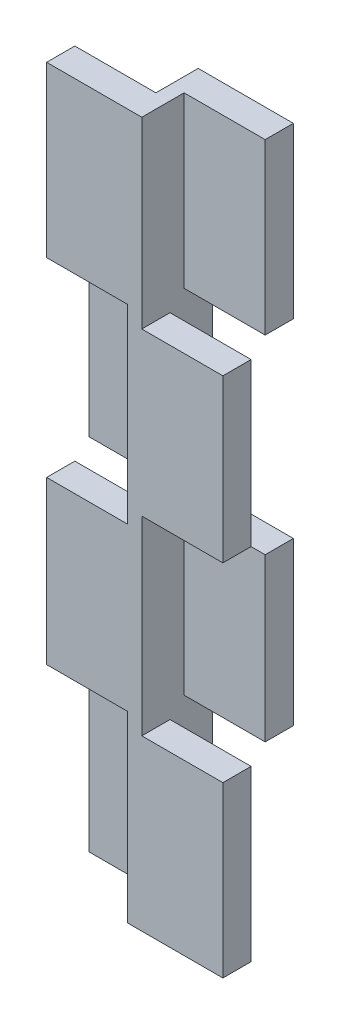
ISO-10303-21;
HEADER;
FILE_DESCRIPTION(('STEP AP214'),'2;1');
FILE_NAME('part.step','',(''),(''),'','','');
FILE_SCHEMA(('AUTOMOTIVE_DESIGN { 1 0 10303 214 1 1 1 1 }'));
ENDSEC;
DATA;
#1=APPLICATION_CONTEXT('core data for automotive mechanical design processes');
#2=APPLICATION_PROTOCOL_DEFINITION('international standard','automotive_design',2000,#1);
#3=PRODUCT_CONTEXT('',#1,'mechanical');
#4=PRODUCT('Part','Part','',(#3));
#5=PRODUCT_RELATED_PRODUCT_CATEGORY('part','',(#4));
#6=PRODUCT_DEFINITION_FORMATION('','',#4);
#7=PRODUCT_DEFINITION_CONTEXT('part definition',#1,'design');
#8=PRODUCT_DEFINITION('design','',#6,#7);
#9=PRODUCT_DEFINITION_SHAPE('','',#8);
#10=(LENGTH_UNIT() NAMED_UNIT(*) SI_UNIT(.MILLI.,.METRE.));
#11=(NAMED_UNIT(*) PLANE_ANGLE_UNIT() SI_UNIT($,.RADIAN.));
#12=(NAMED_UNIT(*) SI_UNIT($,.STERADIAN.) SOLID_ANGLE_UNIT());
#13=UNCERTAINTY_MEASURE_WITH_UNIT(LENGTH_MEASURE(1.E-05),#10,'distance_accuracy_value','');
#14=(GEOMETRIC_REPRESENTATION_CONTEXT(3) GLOBAL_UNCERTAINTY_ASSIGNED_CONTEXT((#13)) GLOBAL_UNIT_ASSIGNED_CONTEXT((#10,
#11,#12)) REPRESENTATION_CONTEXT('',''));
#15=CARTESIAN_POINT('',(0.,0.,0.));
#16=DIRECTION('',(0.,0.,1.));
#17=DIRECTION('',(1.,0.,0.));
#18=AXIS2_PLACEMENT_3D('',#15,#16,#17);
#19=CARTESIAN_POINT('',(0.25,0.,0.1));
#20=DIRECTION('',(-1.,0.,0.));
#21=DIRECTION('',(0.,0.,1.));
#22=AXIS2_PLACEMENT_3D('',#19,#20,#21);
#23=PLANE('',#22);
#24=DIRECTION('',(0.,0.,-1.));
#25=VECTOR('',#24,1.);
#26=CARTESIAN_POINT('',(0.25,0.,0.1));
#27=LINE('',#26,#25);
#28=CARTESIAN_POINT('',(0.25,0.,0.1));
#29=VERTEX_POINT('',#28);
#30=CARTESIAN_POINT('',(0.25,0.,0.0599999999999999));
#31=VERTEX_POINT('',#30);
#32=EDGE_CURVE('E11',#29,#31,#27,.T.);
#33=ORIENTED_EDGE('',*,*,#32,.T.);
#34=DIRECTION('',(0.,-1.,0.));
#35=VECTOR('',#34,1.);
#36=CARTESIAN_POINT('',(0.25,0.24,0.0599999999999999));
#37=LINE('',#36,#35);
#38=CARTESIAN_POINT('',(0.25,0.24,0.0599999999999999));
#39=VERTEX_POINT('',#38);
#40=EDGE_CURVE('E265',#39,#31,#37,.T.);
#41=ORIENTED_EDGE('',*,*,#40,.F.);
#42=DIRECTION('',(0.,0.,-1.));
#43=VECTOR('',#42,1.);
#44=CARTESIAN_POINT('',(0.25,0.24,0.1));
#45=LINE('',#44,#43);
#46=CARTESIAN_POINT('',(0.25,0.24,0.1));
#47=VERTEX_POINT('',#46);
#48=EDGE_CURVE('E573',#47,#39,#45,.T.);
#49=ORIENTED_EDGE('',*,*,#48,.F.);
#50=DIRECTION('',(0.,1.,0.));
#51=VECTOR('',#50,1.);
#52=CARTESIAN_POINT('',(0.25,0.,0.1));
#53=LINE('',#52,#51);
#54=EDGE_CURVE('E444',#29,#47,#53,.T.);
#55=ORIENTED_EDGE('',*,*,#54,.F.);
#56=EDGE_LOOP('',(#33,#41,#49,#55));
#57=FACE_BOUND('',#56,.T.);
#58=ADVANCED_FACE('F39',(#57),#23,.F.);
#59=CARTESIAN_POINT('',(0.25,0.51,0.1));
#60=VERTEX_POINT('',#59);
#61=CARTESIAN_POINT('',(0.25,0.739819694263032,0.1));
#62=VERTEX_POINT('',#61);
#63=EDGE_CURVE('E443',#60,#62,#53,.T.);
#64=ORIENTED_EDGE('',*,*,#63,.F.);
#65=DIRECTION('',(0.,0.,1.));
#66=VECTOR('',#65,1.);
#67=CARTESIAN_POINT('',(0.25,0.51,0.0599999999999999));
#68=LINE('',#67,#66);
#69=CARTESIAN_POINT('',(0.25,0.51,0.0599999999999999));
#70=VERTEX_POINT('',#69);
#71=EDGE_CURVE('E570',#70,#60,#68,.T.);
#72=ORIENTED_EDGE('',*,*,#71,.F.);
#73=DIRECTION('',(0.,-1.,0.));
#74=VECTOR('',#73,1.);
#75=CARTESIAN_POINT('',(0.25,0.739819694263032,0.06));
#76=LINE('',#75,#74);
#77=CARTESIAN_POINT('',(0.25,0.739819694263032,0.06));
#78=VERTEX_POINT('',#77);
#79=EDGE_CURVE('E566',#78,#70,#76,.T.);
#80=ORIENTED_EDGE('',*,*,#79,.F.);
#81=DIRECTION('',(0.,0.,-1.));
#82=VECTOR('',#81,1.);
#83=CARTESIAN_POINT('',(0.25,0.739819694263032,0.1));
#84=LINE('',#83,#82);
#85=EDGE_CURVE('E562',#62,#78,#84,.T.);
#86=ORIENTED_EDGE('',*,*,#85,.F.);
#87=EDGE_LOOP('',(#64,#72,#80,#86));
#88=FACE_BOUND('',#87,.T.);
#89=ADVANCED_FACE('F641',(#88),#23,.F.);
#90=DIRECTION('',(0.,0.,-1.));
#91=VECTOR('',#90,1.);
#92=CARTESIAN_POINT('',(0.25,1.,0.1));
#93=LINE('',#92,#91);
#94=CARTESIAN_POINT('',(0.25,1.,0.0399999999999999));
#95=VERTEX_POINT('',#94);
#96=CARTESIAN_POINT('',(0.25,1.,0.));
#97=VERTEX_POINT('',#96);
#98=EDGE_CURVE('E48',#95,#97,#93,.T.);
#99=ORIENTED_EDGE('',*,*,#98,.F.);
#100=DIRECTION('',(0.,1.,0.));
#101=VECTOR('',#100,1.);
#102=CARTESIAN_POINT('',(0.25,0.759819694263032,0.0399999999999999));
#103=LINE('',#102,#101);
#104=CARTESIAN_POINT('',(0.25,0.759819694263032,0.0399999999999999));
#105=VERTEX_POINT('',#104);
#106=EDGE_CURVE('E559',#105,#95,#103,.T.);
#107=ORIENTED_EDGE('',*,*,#106,.F.);
#108=DIRECTION('',(0.,0.,1.));
#109=VECTOR('',#108,1.);
#110=CARTESIAN_POINT('',(0.25,0.759819694263032,0.));
#111=LINE('',#110,#109);
#112=CARTESIAN_POINT('',(0.25,0.759819694263032,0.));
#113=VERTEX_POINT('',#112);
#114=EDGE_CURVE('E330',#113,#105,#111,.T.);
#115=ORIENTED_EDGE('',*,*,#114,.F.);
#116=DIRECTION('',(0.,1.,0.));
#117=VECTOR('',#116,1.);
#118=CARTESIAN_POINT('',(0.25,0.,0.));
#119=LINE('',#118,#117);
#120=EDGE_CURVE('E282',#113,#97,#119,.T.);
#121=ORIENTED_EDGE('',*,*,#120,.T.);
#122=EDGE_LOOP('',(#99,#107,#115,#121));
#123=FACE_BOUND('',#122,.T.);
#124=ADVANCED_FACE('F328',(#123),#23,.F.);
#125=CARTESIAN_POINT('',(0.,0.,0.1));
#126=DIRECTION('',(-1.,0.,0.));
#127=DIRECTION('',(0.,0.,1.));
#128=AXIS2_PLACEMENT_3D('',#125,#126,#127);
#129=PLANE('',#128);
#130=DIRECTION('',(0.,-1.,0.));
#131=VECTOR('',#130,1.);
#132=CARTESIAN_POINT('',(0.,0.24,0.0400000000000001));
#133=LINE('',#132,#131);
#134=CARTESIAN_POINT('',(0.,0.24,0.0400000000000001));
#135=VERTEX_POINT('',#134);
#136=CARTESIAN_POINT('',(0.,0.,0.0400000000000001));
#137=VERTEX_POINT('',#136);
#138=EDGE_CURVE('E364',#135,#137,#133,.T.);
#139=ORIENTED_EDGE('',*,*,#138,.F.);
#140=DIRECTION('',(0.,0.,1.));
#141=VECTOR('',#140,1.);
#142=CARTESIAN_POINT('',(0.,0.24,0.));
#143=LINE('',#142,#141);
#144=CARTESIAN_POINT('',(0.,0.24,0.));
#145=VERTEX_POINT('',#144);
#146=EDGE_CURVE('E397',#145,#135,#143,.T.);
#147=ORIENTED_EDGE('',*,*,#146,.F.);
#148=DIRECTION('',(0.,1.,0.));
#149=VECTOR('',#148,1.);
#150=CARTESIAN_POINT('',(0.,0.,0.));
#151=LINE('',#150,#149);
#152=CARTESIAN_POINT('',(0.,0.,0.));
#153=VERTEX_POINT('',#152);
#154=EDGE_CURVE('E302',#153,#145,#151,.T.);
#155=ORIENTED_EDGE('',*,*,#154,.F.);
#156=DIRECTION('',(0.,0.,-1.));
#157=VECTOR('',#156,1.);
#158=CARTESIAN_POINT('',(0.,0.,0.1));
#159=LINE('',#158,#157);
#160=EDGE_CURVE('E280',#137,#153,#159,.T.);
#161=ORIENTED_EDGE('',*,*,#160,.F.);
#162=EDGE_LOOP('',(#139,#147,#155,#161));
#163=FACE_BOUND('',#162,.T.);
#164=ADVANCED_FACE('F657',(#163),#129,.T.);
#165=DIRECTION('',(0.,0.,-1.));
#166=VECTOR('',#165,1.);
#167=CARTESIAN_POINT('',(0.,0.51,0.0400000000000001));
#168=LINE('',#167,#166);
#169=CARTESIAN_POINT('',(0.,0.51,0.0400000000000001));
#170=VERTEX_POINT('',#169);
#171=CARTESIAN_POINT('',(0.,0.51,0.));
#172=VERTEX_POINT('',#171);
#173=EDGE_CURVE('E394',#170,#172,#168,.T.);
#174=ORIENTED_EDGE('',*,*,#173,.F.);
#175=DIRECTION('',(0.,-1.,0.));
#176=VECTOR('',#175,1.);
#177=CARTESIAN_POINT('',(0.,0.74,0.04));
#178=LINE('',#177,#176);
#179=CARTESIAN_POINT('',(0.,0.74,0.04));
#180=VERTEX_POINT('',#179);
#181=EDGE_CURVE('E390',#180,#170,#178,.T.);
#182=ORIENTED_EDGE('',*,*,#181,.F.);
#183=DIRECTION('',(0.,0.,1.));
#184=VECTOR('',#183,1.);
#185=CARTESIAN_POINT('',(0.,0.74,0.));
#186=LINE('',#185,#184);
#187=CARTESIAN_POINT('',(0.,0.74,0.));
#188=VERTEX_POINT('',#187);
#189=EDGE_CURVE('E386',#188,#180,#186,.T.);
#190=ORIENTED_EDGE('',*,*,#189,.F.);
#191=EDGE_CURVE('E301',#172,#188,#151,.T.);
#192=ORIENTED_EDGE('',*,*,#191,.F.);
#193=EDGE_LOOP('',(#174,#182,#190,#192));
#194=FACE_BOUND('',#193,.T.);
#195=ADVANCED_FACE('F661',(#194),#129,.T.);
#196=DIRECTION('',(0.,1.,0.));
#197=VECTOR('',#196,1.);
#198=CARTESIAN_POINT('',(0.,0.76,0.06));
#199=LINE('',#198,#197);
#200=CARTESIAN_POINT('',(0.,0.76,0.06));
#201=VERTEX_POINT('',#200);
#202=CARTESIAN_POINT('',(0.,1.,0.0600000000000001));
#203=VERTEX_POINT('',#202);
#204=EDGE_CURVE('E383',#201,#203,#199,.T.);
#205=ORIENTED_EDGE('',*,*,#204,.F.);
#206=DIRECTION('',(0.,0.,-1.));
#207=VECTOR('',#206,1.);
#208=CARTESIAN_POINT('',(0.,0.76,0.1));
#209=LINE('',#208,#207);
#210=CARTESIAN_POINT('',(0.,0.76,0.1));
#211=VERTEX_POINT('',#210);
#212=EDGE_CURVE('E379',#211,#201,#209,.T.);
#213=ORIENTED_EDGE('',*,*,#212,.F.);
#214=DIRECTION('',(0.,1.,0.));
#215=VECTOR('',#214,1.);
#216=CARTESIAN_POINT('',(0.,0.,0.1));
#217=LINE('',#216,#215);
#218=CARTESIAN_POINT('',(0.,1.,0.1));
#219=VERTEX_POINT('',#218);
#220=EDGE_CURVE('E294',#211,#219,#217,.T.);
#221=ORIENTED_EDGE('',*,*,#220,.T.);
#222=DIRECTION('',(0.,0.,-1.));
#223=VECTOR('',#222,1.);
#224=CARTESIAN_POINT('',(0.,1.,0.1));
#225=LINE('',#224,#223);
#226=EDGE_CURVE('E308',#219,#203,#225,.T.);
#227=ORIENTED_EDGE('',*,*,#226,.T.);
#228=EDGE_LOOP('',(#205,#213,#221,#227));
#229=FACE_BOUND('',#228,.T.);
#230=ADVANCED_FACE('F506',(#229),#129,.T.);
#231=CARTESIAN_POINT('',(0.,0.,0.1));
#232=DIRECTION('',(0.,1.,0.));
#233=DIRECTION('',(0.,0.,1.));
#234=AXIS2_PLACEMENT_3D('',#231,#232,#233);
#235=PLANE('',#234);
#236=DIRECTION('',(0.,0.,-1.));
#237=VECTOR('',#236,1.);
#238=CARTESIAN_POINT('',(0.135,0.,0.0599999999999999));
#239=LINE('',#238,#237);
#240=CARTESIAN_POINT('',(0.135,0.,0.0599999999999999));
#241=VERTEX_POINT('',#240);
#242=CARTESIAN_POINT('',(0.135,0.,0.));
#243=VERTEX_POINT('',#242);
#244=EDGE_CURVE('E252',#241,#243,#239,.T.);
#245=ORIENTED_EDGE('',*,*,#244,.F.);
#246=DIRECTION('',(1.,0.,0.));
#247=VECTOR('',#246,1.);
#248=CARTESIAN_POINT('',(0.135,0.,0.0599999999999999));
#249=LINE('',#248,#247);
#250=EDGE_CURVE('E368',#241,#31,#249,.T.);
#251=ORIENTED_EDGE('',*,*,#250,.T.);
#252=ORIENTED_EDGE('',*,*,#32,.F.);
#253=DIRECTION('',(1.,0.,0.));
#254=VECTOR('',#253,1.);
#255=CARTESIAN_POINT('',(0.,0.,0.1));
#256=LINE('',#255,#254);
#257=CARTESIAN_POINT('',(0.115,0.,0.1));
#258=VERTEX_POINT('',#257);
#259=EDGE_CURVE('E305',#258,#29,#256,.T.);
#260=ORIENTED_EDGE('',*,*,#259,.F.);
#261=DIRECTION('',(0.,0.,1.));
#262=VECTOR('',#261,1.);
#263=CARTESIAN_POINT('',(0.115,0.,0.0400000000000001));
#264=LINE('',#263,#262);
#265=CARTESIAN_POINT('',(0.115,0.,0.0400000000000001));
#266=VERTEX_POINT('',#265);
#267=EDGE_CURVE('E620',#266,#258,#264,.T.);
#268=ORIENTED_EDGE('',*,*,#267,.F.);
#269=DIRECTION('',(-1.,0.,0.));
#270=VECTOR('',#269,1.);
#271=CARTESIAN_POINT('',(0.115,0.,0.0400000000000001));
#272=LINE('',#271,#270);
#273=EDGE_CURVE('E363',#266,#137,#272,.T.);
#274=ORIENTED_EDGE('',*,*,#273,.T.);
#275=ORIENTED_EDGE('',*,*,#160,.T.);
#276=DIRECTION('',(1.,0.,0.));
#277=VECTOR('',#276,1.);
#278=CARTESIAN_POINT('',(0.,0.,0.));
#279=LINE('',#278,#277);
#280=EDGE_CURVE('E272',#153,#243,#279,.T.);
#281=ORIENTED_EDGE('',*,*,#280,.T.);
#282=EDGE_LOOP('',(#245,#251,#252,#260,#268,#274,#275,#281));
#283=FACE_BOUND('',#282,.T.);
#284=ADVANCED_FACE('F41',(#283),#235,.F.);
#285=CARTESIAN_POINT('',(0.25,0.26,0.));
#286=VERTEX_POINT('',#285);
#287=CARTESIAN_POINT('',(0.25,0.49,0.));
#288=VERTEX_POINT('',#287);
#289=EDGE_CURVE('E288',#286,#288,#119,.T.);
#290=ORIENTED_EDGE('',*,*,#289,.T.);
#291=DIRECTION('',(0.,0.,-1.));
#292=VECTOR('',#291,1.);
#293=CARTESIAN_POINT('',(0.25,0.49,0.0399999999999999));
#294=LINE('',#293,#292);
#295=CARTESIAN_POINT('',(0.25,0.49,0.0399999999999999));
#296=VERTEX_POINT('',#295);
#297=EDGE_CURVE('E554',#296,#288,#294,.T.);
#298=ORIENTED_EDGE('',*,*,#297,.F.);
#299=DIRECTION('',(0.,1.,0.));
#300=VECTOR('',#299,1.);
#301=CARTESIAN_POINT('',(0.25,0.26,0.0399999999999999));
#302=LINE('',#301,#300);
#303=CARTESIAN_POINT('',(0.25,0.26,0.0399999999999999));
#304=VERTEX_POINT('',#303);
#305=EDGE_CURVE('E550',#304,#296,#302,.T.);
#306=ORIENTED_EDGE('',*,*,#305,.F.);
#307=DIRECTION('',(0.,0.,1.));
#308=VECTOR('',#307,1.);
#309=CARTESIAN_POINT('',(0.25,0.26,0.));
#310=LINE('',#309,#308);
#311=EDGE_CURVE('E546',#286,#304,#310,.T.);
#312=ORIENTED_EDGE('',*,*,#311,.F.);
#313=EDGE_LOOP('',(#290,#298,#306,#312));
#314=FACE_BOUND('',#313,.T.);
#315=ADVANCED_FACE('F643',(#314),#23,.F.);
#316=CARTESIAN_POINT('',(0.,1.,0.1));
#317=DIRECTION('',(0.,1.,0.));
#318=DIRECTION('',(0.,0.,1.));
#319=AXIS2_PLACEMENT_3D('',#316,#317,#318);
#320=PLANE('',#319);
#321=DIRECTION('',(1.,0.,0.));
#322=VECTOR('',#321,1.);
#323=CARTESIAN_POINT('',(0.135,1.,0.0399999999999999));
#324=LINE('',#323,#322);
#325=CARTESIAN_POINT('',(0.135,1.,0.0399999999999999));
#326=VERTEX_POINT('',#325);
#327=EDGE_CURVE('E323',#326,#95,#324,.T.);
#328=ORIENTED_EDGE('',*,*,#327,.T.);
#329=ORIENTED_EDGE('',*,*,#98,.T.);
#330=DIRECTION('',(1.,0.,0.));
#331=VECTOR('',#330,1.);
#332=CARTESIAN_POINT('',(0.,1.,0.));
#333=LINE('',#332,#331);
#334=CARTESIAN_POINT('',(0.115,1.,0.));
#335=VERTEX_POINT('',#334);
#336=EDGE_CURVE('E297',#335,#97,#333,.T.);
#337=ORIENTED_EDGE('',*,*,#336,.F.);
#338=DIRECTION('',(0.,0.,-1.));
#339=VECTOR('',#338,1.);
#340=CARTESIAN_POINT('',(0.115,1.,0.0600000000000001));
#341=LINE('',#340,#339);
#342=CARTESIAN_POINT('',(0.115,1.,0.0600000000000001));
#343=VERTEX_POINT('',#342);
#344=EDGE_CURVE('E341',#343,#335,#341,.T.);
#345=ORIENTED_EDGE('',*,*,#344,.F.);
#346=DIRECTION('',(-1.,0.,0.));
#347=VECTOR('',#346,1.);
#348=CARTESIAN_POINT('',(0.115,1.,0.0600000000000001));
#349=LINE('',#348,#347);
#350=EDGE_CURVE('E416',#343,#203,#349,.T.);
#351=ORIENTED_EDGE('',*,*,#350,.T.);
#352=ORIENTED_EDGE('',*,*,#226,.F.);
#353=DIRECTION('',(1.,0.,0.));
#354=VECTOR('',#353,1.);
#355=CARTESIAN_POINT('',(0.,1.,0.1));
#356=LINE('',#355,#354);
#357=CARTESIAN_POINT('',(0.135,1.,0.1));
#358=VERTEX_POINT('',#357);
#359=EDGE_CURVE('E447',#219,#358,#356,.T.);
#360=ORIENTED_EDGE('',*,*,#359,.T.);
#361=DIRECTION('',(0.,0.,1.));
#362=VECTOR('',#361,1.);
#363=CARTESIAN_POINT('',(0.135,1.,0.0399999999999999));
#364=LINE('',#363,#362);
#365=EDGE_CURVE('E519',#326,#358,#364,.T.);
#366=ORIENTED_EDGE('',*,*,#365,.F.);
#367=EDGE_LOOP('',(#328,#329,#337,#345,#351,#352,#360,#366));
#368=FACE_BOUND('',#367,.T.);
#369=ADVANCED_FACE('F320',(#368),#320,.T.);
#370=DIRECTION('',(0.,0.,1.));
#371=VECTOR('',#370,1.);
#372=CARTESIAN_POINT('',(0.,0.49,0.0600000000000001));
#373=LINE('',#372,#371);
#374=CARTESIAN_POINT('',(0.,0.49,0.0600000000000001));
#375=VERTEX_POINT('',#374);
#376=CARTESIAN_POINT('',(0.,0.49,0.1));
#377=VERTEX_POINT('',#376);
#378=EDGE_CURVE('E376',#375,#377,#373,.T.);
#379=ORIENTED_EDGE('',*,*,#378,.F.);
#380=DIRECTION('',(0.,1.,0.));
#381=VECTOR('',#380,1.);
#382=CARTESIAN_POINT('',(0.,0.26,0.0600000000000001));
#383=LINE('',#382,#381);
#384=CARTESIAN_POINT('',(0.,0.26,0.0600000000000001));
#385=VERTEX_POINT('',#384);
#386=EDGE_CURVE('E372',#385,#375,#383,.T.);
#387=ORIENTED_EDGE('',*,*,#386,.F.);
#388=DIRECTION('',(0.,0.,-1.));
#389=VECTOR('',#388,1.);
#390=CARTESIAN_POINT('',(0.,0.26,0.1));
#391=LINE('',#390,#389);
#392=CARTESIAN_POINT('',(0.,0.26,0.1));
#393=VERTEX_POINT('',#392);
#394=EDGE_CURVE('E367',#393,#385,#391,.T.);
#395=ORIENTED_EDGE('',*,*,#394,.F.);
#396=EDGE_CURVE('E309',#393,#377,#217,.T.);
#397=ORIENTED_EDGE('',*,*,#396,.T.);
#398=EDGE_LOOP('',(#379,#387,#395,#397));
#399=FACE_BOUND('',#398,.T.);
#400=ADVANCED_FACE('F465',(#399),#129,.T.);
#401=CARTESIAN_POINT('',(0.,0.,0.1));
#402=DIRECTION('',(0.,0.,1.));
#403=DIRECTION('',(1.,0.,0.));
#404=AXIS2_PLACEMENT_3D('',#401,#402,#403);
#405=PLANE('',#404);
#406=DIRECTION('',(1.,0.,0.));
#407=VECTOR('',#406,1.);
#408=CARTESIAN_POINT('',(0.135,0.24,0.1));
#409=LINE('',#408,#407);
#410=CARTESIAN_POINT('',(0.135,0.24,0.1));
#411=VERTEX_POINT('',#410);
#412=EDGE_CURVE('E583',#411,#47,#409,.T.);
#413=ORIENTED_EDGE('',*,*,#412,.F.);
#414=DIRECTION('',(0.,-1.,0.));
#415=VECTOR('',#414,1.);
#416=CARTESIAN_POINT('',(0.135,0.51,0.1));
#417=LINE('',#416,#415);
#418=CARTESIAN_POINT('',(0.135,0.51,0.1));
#419=VERTEX_POINT('',#418);
#420=EDGE_CURVE('E538',#419,#411,#417,.T.);
#421=ORIENTED_EDGE('',*,*,#420,.F.);
#422=DIRECTION('',(1.,0.,0.));
#423=VECTOR('',#422,1.);
#424=CARTESIAN_POINT('',(0.135,0.51,0.1));
#425=LINE('',#424,#423);
#426=EDGE_CURVE('E586',#419,#60,#425,.T.);
#427=ORIENTED_EDGE('',*,*,#426,.T.);
#428=ORIENTED_EDGE('',*,*,#63,.T.);
#429=DIRECTION('',(1.,0.,0.));
#430=VECTOR('',#429,1.);
#431=CARTESIAN_POINT('',(0.135,0.739819694263032,0.1));
#432=LINE('',#431,#430);
#433=CARTESIAN_POINT('',(0.135,0.739819694263032,0.1));
#434=VERTEX_POINT('',#433);
#435=EDGE_CURVE('E515',#434,#62,#432,.T.);
#436=ORIENTED_EDGE('',*,*,#435,.F.);
#437=DIRECTION('',(0.,-1.,0.));
#438=VECTOR('',#437,1.);
#439=CARTESIAN_POINT('',(0.135,1.,0.1));
#440=LINE('',#439,#438);
#441=EDGE_CURVE('E513',#358,#434,#440,.T.);
#442=ORIENTED_EDGE('',*,*,#441,.F.);
#443=ORIENTED_EDGE('',*,*,#359,.F.);
#444=ORIENTED_EDGE('',*,*,#220,.F.);
#445=DIRECTION('',(-1.,0.,0.));
#446=VECTOR('',#445,1.);
#447=CARTESIAN_POINT('',(0.115,0.76,0.1));
#448=LINE('',#447,#446);
#449=CARTESIAN_POINT('',(0.115,0.76,0.1));
#450=VERTEX_POINT('',#449);
#451=EDGE_CURVE('E423',#450,#211,#448,.T.);
#452=ORIENTED_EDGE('',*,*,#451,.F.);
#453=DIRECTION('',(0.,1.,0.));
#454=VECTOR('',#453,1.);
#455=CARTESIAN_POINT('',(0.115,0.49,0.1));
#456=LINE('',#455,#454);
#457=CARTESIAN_POINT('',(0.115,0.49,0.1));
#458=VERTEX_POINT('',#457);
#459=EDGE_CURVE('E475',#458,#450,#456,.T.);
#460=ORIENTED_EDGE('',*,*,#459,.F.);
#461=DIRECTION('',(-1.,0.,0.));
#462=VECTOR('',#461,1.);
#463=CARTESIAN_POINT('',(0.115,0.49,0.1));
#464=LINE('',#463,#462);
#465=EDGE_CURVE('E426',#458,#377,#464,.T.);
#466=ORIENTED_EDGE('',*,*,#465,.T.);
#467=ORIENTED_EDGE('',*,*,#396,.F.);
#468=DIRECTION('',(-1.,0.,0.));
#469=VECTOR('',#468,1.);
#470=CARTESIAN_POINT('',(0.115,0.26,0.1));
#471=LINE('',#470,#469);
#472=CARTESIAN_POINT('',(0.115,0.26,0.1));
#473=VERTEX_POINT('',#472);
#474=EDGE_CURVE('E436',#473,#393,#471,.T.);
#475=ORIENTED_EDGE('',*,*,#474,.F.);
#476=DIRECTION('',(0.,1.,0.));
#477=VECTOR('',#476,1.);
#478=CARTESIAN_POINT('',(0.115,0.,0.1));
#479=LINE('',#478,#477);
#480=EDGE_CURVE('E623',#258,#473,#479,.T.);
#481=ORIENTED_EDGE('',*,*,#480,.F.);
#482=ORIENTED_EDGE('',*,*,#259,.T.);
#483=ORIENTED_EDGE('',*,*,#54,.T.);
#484=EDGE_LOOP('',(#413,#421,#427,#428,#436,#442,#443,#444,#452,#460,#466,#467,#475,#481,#482,#483));
#485=FACE_BOUND('',#484,.T.);
#486=ADVANCED_FACE('F470',(#485),#405,.T.);
#487=CARTESIAN_POINT('',(0.,0.,0.));
#488=DIRECTION('',(0.,0.,1.));
#489=DIRECTION('',(1.,0.,0.));
#490=AXIS2_PLACEMENT_3D('',#487,#488,#489);
#491=PLANE('',#490);
#492=ORIENTED_EDGE('',*,*,#289,.F.);
#493=DIRECTION('',(1.,0.,0.));
#494=VECTOR('',#493,1.);
#495=CARTESIAN_POINT('',(0.135,0.26,0.));
#496=LINE('',#495,#494);
#497=CARTESIAN_POINT('',(0.135,0.26,0.));
#498=VERTEX_POINT('',#497);
#499=EDGE_CURVE('E274',#498,#286,#496,.T.);
#500=ORIENTED_EDGE('',*,*,#499,.F.);
#501=DIRECTION('',(0.,1.,0.));
#502=VECTOR('',#501,1.);
#503=CARTESIAN_POINT('',(0.135,0.,0.));
#504=LINE('',#503,#502);
#505=EDGE_CURVE('E256',#243,#498,#504,.T.);
#506=ORIENTED_EDGE('',*,*,#505,.F.);
#507=ORIENTED_EDGE('',*,*,#280,.F.);
#508=ORIENTED_EDGE('',*,*,#154,.T.);
#509=DIRECTION('',(-1.,0.,0.));
#510=VECTOR('',#509,1.);
#511=CARTESIAN_POINT('',(0.115,0.24,0.));
#512=LINE('',#511,#510);
#513=CARTESIAN_POINT('',(0.115,0.24,0.));
#514=VERTEX_POINT('',#513);
#515=EDGE_CURVE('E291',#514,#145,#512,.T.);
#516=ORIENTED_EDGE('',*,*,#515,.F.);
#517=DIRECTION('',(0.,-1.,0.));
#518=VECTOR('',#517,1.);
#519=CARTESIAN_POINT('',(0.115,0.51,0.));
#520=LINE('',#519,#518);
#521=CARTESIAN_POINT('',(0.115,0.51,0.));
#522=VERTEX_POINT('',#521);
#523=EDGE_CURVE('E357',#522,#514,#520,.T.);
#524=ORIENTED_EDGE('',*,*,#523,.F.);
#525=DIRECTION('',(-1.,0.,0.));
#526=VECTOR('',#525,1.);
#527=CARTESIAN_POINT('',(0.115,0.51,0.));
#528=LINE('',#527,#526);
#529=EDGE_CURVE('E404',#522,#172,#528,.T.);
#530=ORIENTED_EDGE('',*,*,#529,.T.);
#531=ORIENTED_EDGE('',*,*,#191,.T.);
#532=DIRECTION('',(-1.,0.,0.));
#533=VECTOR('',#532,1.);
#534=CARTESIAN_POINT('',(0.115,0.74,0.));
#535=LINE('',#534,#533);
#536=CARTESIAN_POINT('',(0.115,0.74,0.));
#537=VERTEX_POINT('',#536);
#538=EDGE_CURVE('E337',#537,#188,#535,.T.);
#539=ORIENTED_EDGE('',*,*,#538,.F.);
#540=DIRECTION('',(0.,-1.,0.));
#541=VECTOR('',#540,1.);
#542=CARTESIAN_POINT('',(0.115,1.,0.));
#543=LINE('',#542,#541);
#544=EDGE_CURVE('E335',#335,#537,#543,.T.);
#545=ORIENTED_EDGE('',*,*,#544,.F.);
#546=ORIENTED_EDGE('',*,*,#336,.T.);
#547=ORIENTED_EDGE('',*,*,#120,.F.);
#548=DIRECTION('',(1.,0.,0.));
#549=VECTOR('',#548,1.);
#550=CARTESIAN_POINT('',(0.135,0.759819694263032,0.));
#551=LINE('',#550,#549);
#552=CARTESIAN_POINT('',(0.135,0.759819694263032,0.));
#553=VERTEX_POINT('',#552);
#554=EDGE_CURVE('E603',#553,#113,#551,.T.);
#555=ORIENTED_EDGE('',*,*,#554,.F.);
#556=DIRECTION('',(0.,1.,0.));
#557=VECTOR('',#556,1.);
#558=CARTESIAN_POINT('',(0.135,0.49,0.));
#559=LINE('',#558,#557);
#560=CARTESIAN_POINT('',(0.135,0.49,0.));
#561=VERTEX_POINT('',#560);
#562=EDGE_CURVE('E1034',#561,#553,#559,.T.);
#563=ORIENTED_EDGE('',*,*,#562,.F.);
#564=DIRECTION('',(1.,0.,0.));
#565=VECTOR('',#564,1.);
#566=CARTESIAN_POINT('',(0.135,0.49,0.));
#567=LINE('',#566,#565);
#568=EDGE_CURVE('E606',#561,#288,#567,.T.);
#569=ORIENTED_EDGE('',*,*,#568,.T.);
#570=EDGE_LOOP('',(#492,#500,#506,#507,#508,#516,#524,#530,#531,#539,#545,#546,#547,#555,#563,#569));
#571=FACE_BOUND('',#570,.T.);
#572=ADVANCED_FACE('F270',(#571),#491,.F.);
#573=CARTESIAN_POINT('',(0.115,0.24,0.0400000000000001));
#574=DIRECTION('',(0.,0.,-1.));
#575=DIRECTION('',(0.,1.,0.));
#576=AXIS2_PLACEMENT_3D('',#573,#574,#575);
#577=PLANE('',#576);
#578=ORIENTED_EDGE('',*,*,#138,.T.);
#579=ORIENTED_EDGE('',*,*,#273,.F.);
#580=DIRECTION('',(0.,-1.,0.));
#581=VECTOR('',#580,1.);
#582=CARTESIAN_POINT('',(0.115,0.24,0.0400000000000001));
#583=LINE('',#582,#581);
#584=CARTESIAN_POINT('',(0.115,0.24,0.0400000000000001));
#585=VERTEX_POINT('',#584);
#586=EDGE_CURVE('E400',#585,#266,#583,.T.);
#587=ORIENTED_EDGE('',*,*,#586,.F.);
#588=DIRECTION('',(-1.,0.,0.));
#589=VECTOR('',#588,1.);
#590=CARTESIAN_POINT('',(0.115,0.24,0.0400000000000001));
#591=LINE('',#590,#589);
#592=EDGE_CURVE('E283',#585,#135,#591,.T.);
#593=ORIENTED_EDGE('',*,*,#592,.T.);
#594=EDGE_LOOP('',(#578,#579,#587,#593));
#595=FACE_BOUND('',#594,.T.);
#596=ADVANCED_FACE('F719',(#595),#577,.F.);
#597=CARTESIAN_POINT('',(0.115,0.24,0.));
#598=DIRECTION('',(0.,-1.,0.));
#599=DIRECTION('',(0.,0.,-1.));
#600=AXIS2_PLACEMENT_3D('',#597,#598,#599);
#601=PLANE('',#600);
#602=ORIENTED_EDGE('',*,*,#146,.T.);
#603=ORIENTED_EDGE('',*,*,#592,.F.);
#604=DIRECTION('',(0.,0.,1.));
#605=VECTOR('',#604,1.);
#606=CARTESIAN_POINT('',(0.115,0.24,0.));
#607=LINE('',#606,#605);
#608=EDGE_CURVE('E359',#514,#585,#607,.T.);
#609=ORIENTED_EDGE('',*,*,#608,.F.);
#610=ORIENTED_EDGE('',*,*,#515,.T.);
#611=EDGE_LOOP('',(#602,#603,#609,#610));
#612=FACE_BOUND('',#611,.T.);
#613=ADVANCED_FACE('F936',(#612),#601,.F.);
#614=CARTESIAN_POINT('',(0.115,0.51,0.0400000000000001));
#615=DIRECTION('',(0.,1.,0.));
#616=DIRECTION('',(0.,0.,1.));
#617=AXIS2_PLACEMENT_3D('',#614,#615,#616);
#618=PLANE('',#617);
#619=ORIENTED_EDGE('',*,*,#173,.T.);
#620=ORIENTED_EDGE('',*,*,#529,.F.);
#621=DIRECTION('',(0.,0.,-1.));
#622=VECTOR('',#621,1.);
#623=CARTESIAN_POINT('',(0.115,0.51,0.0400000000000001));
#624=LINE('',#623,#622);
#625=CARTESIAN_POINT('',(0.115,0.51,0.0400000000000001));
#626=VERTEX_POINT('',#625);
#627=EDGE_CURVE('E63',#626,#522,#624,.T.);
#628=ORIENTED_EDGE('',*,*,#627,.F.);
#629=DIRECTION('',(-1.,0.,0.));
#630=VECTOR('',#629,1.);
#631=CARTESIAN_POINT('',(0.115,0.51,0.0400000000000001));
#632=LINE('',#631,#630);
#633=EDGE_CURVE('E408',#626,#170,#632,.T.);
#634=ORIENTED_EDGE('',*,*,#633,.T.);
#635=EDGE_LOOP('',(#619,#620,#628,#634));
#636=FACE_BOUND('',#635,.T.);
#637=ADVANCED_FACE('F926',(#636),#618,.F.);
#638=CARTESIAN_POINT('',(0.115,0.74,0.04));
#639=DIRECTION('',(0.,0.,-1.));
#640=DIRECTION('',(0.,1.,0.));
#641=AXIS2_PLACEMENT_3D('',#638,#639,#640);
#642=PLANE('',#641);
#643=ORIENTED_EDGE('',*,*,#181,.T.);
#644=ORIENTED_EDGE('',*,*,#633,.F.);
#645=DIRECTION('',(0.,-1.,0.));
#646=VECTOR('',#645,1.);
#647=CARTESIAN_POINT('',(0.115,0.74,0.04));
#648=LINE('',#647,#646);
#649=CARTESIAN_POINT('',(0.115,0.74,0.04));
#650=VERTEX_POINT('',#649);
#651=EDGE_CURVE('E347',#650,#626,#648,.T.);
#652=ORIENTED_EDGE('',*,*,#651,.F.);
#653=DIRECTION('',(-1.,0.,0.));
#654=VECTOR('',#653,1.);
#655=CARTESIAN_POINT('',(0.115,0.74,0.04));
#656=LINE('',#655,#654);
#657=EDGE_CURVE('E411',#650,#180,#656,.T.);
#658=ORIENTED_EDGE('',*,*,#657,.T.);
#659=EDGE_LOOP('',(#643,#644,#652,#658));
#660=FACE_BOUND('',#659,.T.);
#661=ADVANCED_FACE('F916',(#660),#642,.F.);
#662=CARTESIAN_POINT('',(0.115,0.74,0.));
#663=DIRECTION('',(0.,-1.,0.));
#664=DIRECTION('',(0.,0.,-1.));
#665=AXIS2_PLACEMENT_3D('',#662,#663,#664);
#666=PLANE('',#665);
#667=ORIENTED_EDGE('',*,*,#189,.T.);
#668=ORIENTED_EDGE('',*,*,#657,.F.);
#669=DIRECTION('',(0.,0.,1.));
#670=VECTOR('',#669,1.);
#671=CARTESIAN_POINT('',(0.115,0.74,0.));
#672=LINE('',#671,#670);
#673=EDGE_CURVE('E340',#537,#650,#672,.T.);
#674=ORIENTED_EDGE('',*,*,#673,.F.);
#675=ORIENTED_EDGE('',*,*,#538,.T.);
#676=EDGE_LOOP('',(#667,#668,#674,#675));
#677=FACE_BOUND('',#676,.T.);
#678=ADVANCED_FACE('F907',(#677),#666,.F.);
#679=CARTESIAN_POINT('',(0.115,0.76,0.06));
#680=DIRECTION('',(0.,0.,1.));
#681=DIRECTION('',(0.,-1.,0.));
#682=AXIS2_PLACEMENT_3D('',#679,#680,#681);
#683=PLANE('',#682);
#684=ORIENTED_EDGE('',*,*,#204,.T.);
#685=ORIENTED_EDGE('',*,*,#350,.F.);
#686=DIRECTION('',(0.,1.,0.));
#687=VECTOR('',#686,1.);
#688=CARTESIAN_POINT('',(0.115,0.76,0.06));
#689=LINE('',#688,#687);
#690=CARTESIAN_POINT('',(0.115,0.76,0.06));
#691=VERTEX_POINT('',#690);
#692=EDGE_CURVE('E349',#691,#343,#689,.T.);
#693=ORIENTED_EDGE('',*,*,#692,.F.);
#694=DIRECTION('',(-1.,0.,0.));
#695=VECTOR('',#694,1.);
#696=CARTESIAN_POINT('',(0.115,0.76,0.06));
#697=LINE('',#696,#695);
#698=EDGE_CURVE('E420',#691,#201,#697,.T.);
#699=ORIENTED_EDGE('',*,*,#698,.T.);
#700=EDGE_LOOP('',(#684,#685,#693,#699));
#701=FACE_BOUND('',#700,.T.);
#702=ADVANCED_FACE('F507',(#701),#683,.F.);
#703=CARTESIAN_POINT('',(0.115,0.76,0.1));
#704=DIRECTION('',(0.,1.,0.));
#705=DIRECTION('',(0.,0.,1.));
#706=AXIS2_PLACEMENT_3D('',#703,#704,#705);
#707=PLANE('',#706);
#708=ORIENTED_EDGE('',*,*,#212,.T.);
#709=ORIENTED_EDGE('',*,*,#698,.F.);
#710=DIRECTION('',(0.,0.,-1.));
#711=VECTOR('',#710,1.);
#712=CARTESIAN_POINT('',(0.115,0.76,0.1));
#713=LINE('',#712,#711);
#714=EDGE_CURVE('E492',#450,#691,#713,.T.);
#715=ORIENTED_EDGE('',*,*,#714,.F.);
#716=ORIENTED_EDGE('',*,*,#451,.T.);
#717=EDGE_LOOP('',(#708,#709,#715,#716));
#718=FACE_BOUND('',#717,.T.);
#719=ADVANCED_FACE('F509',(#718),#707,.F.);
#720=CARTESIAN_POINT('',(0.115,0.49,0.0600000000000001));
#721=DIRECTION('',(0.,-1.,0.));
#722=DIRECTION('',(0.,0.,-1.));
#723=AXIS2_PLACEMENT_3D('',#720,#721,#722);
#724=PLANE('',#723);
#725=ORIENTED_EDGE('',*,*,#378,.T.);
#726=ORIENTED_EDGE('',*,*,#465,.F.);
#727=DIRECTION('',(0.,0.,1.));
#728=VECTOR('',#727,1.);
#729=CARTESIAN_POINT('',(0.115,0.49,0.0600000000000001));
#730=LINE('',#729,#728);
#731=CARTESIAN_POINT('',(0.115,0.49,0.0600000000000001));
#732=VERTEX_POINT('',#731);
#733=EDGE_CURVE('E480',#732,#458,#730,.T.);
#734=ORIENTED_EDGE('',*,*,#733,.F.);
#735=DIRECTION('',(-1.,0.,0.));
#736=VECTOR('',#735,1.);
#737=CARTESIAN_POINT('',(0.115,0.49,0.0600000000000001));
#738=LINE('',#737,#736);
#739=EDGE_CURVE('E430',#732,#375,#738,.T.);
#740=ORIENTED_EDGE('',*,*,#739,.T.);
#741=EDGE_LOOP('',(#725,#726,#734,#740));
#742=FACE_BOUND('',#741,.T.);
#743=ADVANCED_FACE('F479',(#742),#724,.F.);
#744=CARTESIAN_POINT('',(0.115,0.26,0.0600000000000001));
#745=DIRECTION('',(0.,0.,1.));
#746=DIRECTION('',(0.,-1.,0.));
#747=AXIS2_PLACEMENT_3D('',#744,#745,#746);
#748=PLANE('',#747);
#749=ORIENTED_EDGE('',*,*,#386,.T.);
#750=ORIENTED_EDGE('',*,*,#739,.F.);
#751=DIRECTION('',(0.,1.,0.));
#752=VECTOR('',#751,1.);
#753=CARTESIAN_POINT('',(0.115,0.26,0.0600000000000001));
#754=LINE('',#753,#752);
#755=CARTESIAN_POINT('',(0.115,0.26,0.0600000000000001));
#756=VERTEX_POINT('',#755);
#757=EDGE_CURVE('E487',#756,#732,#754,.T.);
#758=ORIENTED_EDGE('',*,*,#757,.F.);
#759=DIRECTION('',(-1.,0.,0.));
#760=VECTOR('',#759,1.);
#761=CARTESIAN_POINT('',(0.115,0.26,0.0600000000000001));
#762=LINE('',#761,#760);
#763=EDGE_CURVE('E433',#756,#385,#762,.T.);
#764=ORIENTED_EDGE('',*,*,#763,.T.);
#765=EDGE_LOOP('',(#749,#750,#758,#764));
#766=FACE_BOUND('',#765,.T.);
#767=ADVANCED_FACE('F631',(#766),#748,.F.);
#768=CARTESIAN_POINT('',(0.115,0.26,0.1));
#769=DIRECTION('',(0.,1.,0.));
#770=DIRECTION('',(0.,0.,1.));
#771=AXIS2_PLACEMENT_3D('',#768,#769,#770);
#772=PLANE('',#771);
#773=ORIENTED_EDGE('',*,*,#394,.T.);
#774=ORIENTED_EDGE('',*,*,#763,.F.);
#775=DIRECTION('',(0.,0.,-1.));
#776=VECTOR('',#775,1.);
#777=CARTESIAN_POINT('',(0.115,0.26,0.1));
#778=LINE('',#777,#776);
#779=EDGE_CURVE('E495',#473,#756,#778,.T.);
#780=ORIENTED_EDGE('',*,*,#779,.F.);
#781=ORIENTED_EDGE('',*,*,#474,.T.);
#782=EDGE_LOOP('',(#773,#774,#780,#781));
#783=FACE_BOUND('',#782,.T.);
#784=ADVANCED_FACE('F629',(#783),#772,.F.);
#785=CARTESIAN_POINT('',(0.115,0.,0.));
#786=DIRECTION('',(-1.,0.,0.));
#787=DIRECTION('',(0.,0.,1.));
#788=AXIS2_PLACEMENT_3D('',#785,#786,#787);
#789=PLANE('',#788);
#790=ORIENTED_EDGE('',*,*,#586,.T.);
#791=ORIENTED_EDGE('',*,*,#267,.T.);
#792=ORIENTED_EDGE('',*,*,#480,.T.);
#793=ORIENTED_EDGE('',*,*,#779,.T.);
#794=ORIENTED_EDGE('',*,*,#757,.T.);
#795=ORIENTED_EDGE('',*,*,#733,.T.);
#796=ORIENTED_EDGE('',*,*,#459,.T.);
#797=ORIENTED_EDGE('',*,*,#714,.T.);
#798=ORIENTED_EDGE('',*,*,#692,.T.);
#799=ORIENTED_EDGE('',*,*,#344,.T.);
#800=ORIENTED_EDGE('',*,*,#544,.T.);
#801=ORIENTED_EDGE('',*,*,#673,.T.);
#802=ORIENTED_EDGE('',*,*,#651,.T.);
#803=ORIENTED_EDGE('',*,*,#627,.T.);
#804=ORIENTED_EDGE('',*,*,#523,.T.);
#805=ORIENTED_EDGE('',*,*,#608,.T.);
#806=EDGE_LOOP('',(#790,#791,#792,#793,#794,#795,#796,#797,#798,#799,#800,#801,#802,#803,#804,#805));
#807=FACE_BOUND('',#806,.T.);
#808=ADVANCED_FACE('F483',(#807),#789,.T.);
#809=CARTESIAN_POINT('',(0.135,0.24,0.0599999999999999));
#810=DIRECTION('',(0.,0.,1.));
#811=DIRECTION('',(0.,-1.,0.));
#812=AXIS2_PLACEMENT_3D('',#809,#810,#811);
#813=PLANE('',#812);
#814=ORIENTED_EDGE('',*,*,#40,.T.);
#815=ORIENTED_EDGE('',*,*,#250,.F.);
#816=DIRECTION('',(0.,-1.,0.));
#817=VECTOR('',#816,1.);
#818=CARTESIAN_POINT('',(0.135,0.24,0.0599999999999999));
#819=LINE('',#818,#817);
#820=CARTESIAN_POINT('',(0.135,0.24,0.0599999999999999));
#821=VERTEX_POINT('',#820);
#822=EDGE_CURVE('E260',#821,#241,#819,.T.);
#823=ORIENTED_EDGE('',*,*,#822,.F.);
#824=DIRECTION('',(1.,0.,0.));
#825=VECTOR('',#824,1.);
#826=CARTESIAN_POINT('',(0.135,0.24,0.0599999999999999));
#827=LINE('',#826,#825);
#828=EDGE_CURVE('E580',#821,#39,#827,.T.);
#829=ORIENTED_EDGE('',*,*,#828,.T.);
#830=EDGE_LOOP('',(#814,#815,#823,#829));
#831=FACE_BOUND('',#830,.T.);
#832=ADVANCED_FACE('F725',(#831),#813,.F.);
#833=CARTESIAN_POINT('',(0.135,0.24,0.1));
#834=DIRECTION('',(0.,-1.,0.));
#835=DIRECTION('',(0.,0.,-1.));
#836=AXIS2_PLACEMENT_3D('',#833,#834,#835);
#837=PLANE('',#836);
#838=ORIENTED_EDGE('',*,*,#48,.T.);
#839=ORIENTED_EDGE('',*,*,#828,.F.);
#840=DIRECTION('',(0.,0.,-1.));
#841=VECTOR('',#840,1.);
#842=CARTESIAN_POINT('',(0.135,0.24,0.1));
#843=LINE('',#842,#841);
#844=EDGE_CURVE('E541',#411,#821,#843,.T.);
#845=ORIENTED_EDGE('',*,*,#844,.F.);
#846=ORIENTED_EDGE('',*,*,#412,.T.);
#847=EDGE_LOOP('',(#838,#839,#845,#846));
#848=FACE_BOUND('',#847,.T.);
#849=ADVANCED_FACE('F730',(#848),#837,.F.);
#850=CARTESIAN_POINT('',(0.135,0.51,0.0599999999999999));
#851=DIRECTION('',(0.,1.,0.));
#852=DIRECTION('',(0.,0.,1.));
#853=AXIS2_PLACEMENT_3D('',#850,#851,#852);
#854=PLANE('',#853);
#855=ORIENTED_EDGE('',*,*,#71,.T.);
#856=ORIENTED_EDGE('',*,*,#426,.F.);
#857=DIRECTION('',(0.,0.,1.));
#858=VECTOR('',#857,1.);
#859=CARTESIAN_POINT('',(0.135,0.51,0.0599999999999999));
#860=LINE('',#859,#858);
#861=CARTESIAN_POINT('',(0.135,0.51,0.0599999999999999));
#862=VERTEX_POINT('',#861);
#863=EDGE_CURVE('E534',#862,#419,#860,.T.);
#864=ORIENTED_EDGE('',*,*,#863,.F.);
#865=DIRECTION('',(1.,0.,0.));
#866=VECTOR('',#865,1.);
#867=CARTESIAN_POINT('',(0.135,0.51,0.0599999999999999));
#868=LINE('',#867,#866);
#869=EDGE_CURVE('E590',#862,#70,#868,.T.);
#870=ORIENTED_EDGE('',*,*,#869,.T.);
#871=EDGE_LOOP('',(#855,#856,#864,#870));
#872=FACE_BOUND('',#871,.T.);
#873=ADVANCED_FACE('F743',(#872),#854,.F.);
#874=CARTESIAN_POINT('',(0.135,0.739819694263032,0.06));
#875=DIRECTION('',(0.,0.,1.));
#876=DIRECTION('',(0.,-1.,0.));
#877=AXIS2_PLACEMENT_3D('',#874,#875,#876);
#878=PLANE('',#877);
#879=ORIENTED_EDGE('',*,*,#79,.T.);
#880=ORIENTED_EDGE('',*,*,#869,.F.);
#881=DIRECTION('',(0.,-1.,0.));
#882=VECTOR('',#881,1.);
#883=CARTESIAN_POINT('',(0.135,0.739819694263032,0.06));
#884=LINE('',#883,#882);
#885=CARTESIAN_POINT('',(0.135,0.739819694263032,0.06));
#886=VERTEX_POINT('',#885);
#887=EDGE_CURVE('E525',#886,#862,#884,.T.);
#888=ORIENTED_EDGE('',*,*,#887,.F.);
#889=DIRECTION('',(1.,0.,0.));
#890=VECTOR('',#889,1.);
#891=CARTESIAN_POINT('',(0.135,0.739819694263032,0.06));
#892=LINE('',#891,#890);
#893=EDGE_CURVE('E593',#886,#78,#892,.T.);
#894=ORIENTED_EDGE('',*,*,#893,.T.);
#895=EDGE_LOOP('',(#879,#880,#888,#894));
#896=FACE_BOUND('',#895,.T.);
#897=ADVANCED_FACE('F754',(#896),#878,.F.);
#898=CARTESIAN_POINT('',(0.135,0.739819694263032,0.1));
#899=DIRECTION('',(0.,-1.,0.));
#900=DIRECTION('',(0.,0.,-1.));
#901=AXIS2_PLACEMENT_3D('',#898,#899,#900);
#902=PLANE('',#901);
#903=ORIENTED_EDGE('',*,*,#85,.T.);
#904=ORIENTED_EDGE('',*,*,#893,.F.);
#905=DIRECTION('',(0.,0.,-1.));
#906=VECTOR('',#905,1.);
#907=CARTESIAN_POINT('',(0.135,0.739819694263032,0.1));
#908=LINE('',#907,#906);
#909=EDGE_CURVE('E518',#434,#886,#908,.T.);
#910=ORIENTED_EDGE('',*,*,#909,.F.);
#911=ORIENTED_EDGE('',*,*,#435,.T.);
#912=EDGE_LOOP('',(#903,#904,#910,#911));
#913=FACE_BOUND('',#912,.T.);
#914=ADVANCED_FACE('F765',(#913),#902,.F.);
#915=CARTESIAN_POINT('',(0.135,0.759819694263032,0.0399999999999999));
#916=DIRECTION('',(0.,0.,-1.));
#917=DIRECTION('',(-1.,0.,0.));
#918=AXIS2_PLACEMENT_3D('',#915,#916,#917);
#919=PLANE('',#918);
#920=ORIENTED_EDGE('',*,*,#106,.T.);
#921=ORIENTED_EDGE('',*,*,#327,.F.);
#922=DIRECTION('',(0.,1.,0.));
#923=VECTOR('',#922,1.);
#924=CARTESIAN_POINT('',(0.135,0.759819694263032,0.0399999999999999));
#925=LINE('',#924,#923);
#926=CARTESIAN_POINT('',(0.135,0.759819694263032,0.0399999999999999));
#927=VERTEX_POINT('',#926);
#928=EDGE_CURVE('E527',#927,#326,#925,.T.);
#929=ORIENTED_EDGE('',*,*,#928,.F.);
#930=DIRECTION('',(1.,0.,0.));
#931=VECTOR('',#930,1.);
#932=CARTESIAN_POINT('',(0.135,0.759819694263032,0.0399999999999999));
#933=LINE('',#932,#931);
#934=EDGE_CURVE('E600',#927,#105,#933,.T.);
#935=ORIENTED_EDGE('',*,*,#934,.T.);
#936=EDGE_LOOP('',(#920,#921,#929,#935));
#937=FACE_BOUND('',#936,.T.);
#938=ADVANCED_FACE('F776',(#937),#919,.F.);
#939=CARTESIAN_POINT('',(0.135,0.759819694263032,0.));
#940=DIRECTION('',(0.,1.,0.));
#941=DIRECTION('',(0.,0.,1.));
#942=AXIS2_PLACEMENT_3D('',#939,#940,#941);
#943=PLANE('',#942);
#944=ORIENTED_EDGE('',*,*,#114,.T.);
#945=ORIENTED_EDGE('',*,*,#934,.F.);
#946=DIRECTION('',(0.,0.,1.));
#947=VECTOR('',#946,1.);
#948=CARTESIAN_POINT('',(0.135,0.759819694263032,0.));
#949=LINE('',#948,#947);
#950=EDGE_CURVE('E1047',#553,#927,#949,.T.);
#951=ORIENTED_EDGE('',*,*,#950,.F.);
#952=ORIENTED_EDGE('',*,*,#554,.T.);
#953=EDGE_LOOP('',(#944,#945,#951,#952));
#954=FACE_BOUND('',#953,.T.);
#955=ADVANCED_FACE('F787',(#954),#943,.F.);
#956=CARTESIAN_POINT('',(0.135,0.49,0.0399999999999999));
#957=DIRECTION('',(0.,-1.,0.));
#958=DIRECTION('',(0.,0.,-1.));
#959=AXIS2_PLACEMENT_3D('',#956,#957,#958);
#960=PLANE('',#959);
#961=ORIENTED_EDGE('',*,*,#297,.T.);
#962=ORIENTED_EDGE('',*,*,#568,.F.);
#963=DIRECTION('',(0.,0.,-1.));
#964=VECTOR('',#963,1.);
#965=CARTESIAN_POINT('',(0.135,0.49,0.0399999999999999));
#966=LINE('',#965,#964);
#967=CARTESIAN_POINT('',(0.135,0.49,0.0399999999999999));
#968=VERTEX_POINT('',#967);
#969=EDGE_CURVE('E55',#968,#561,#966,.T.);
#970=ORIENTED_EDGE('',*,*,#969,.F.);
#971=DIRECTION('',(1.,0.,0.));
#972=VECTOR('',#971,1.);
#973=CARTESIAN_POINT('',(0.135,0.49,0.0399999999999999));
#974=LINE('',#973,#972);
#975=EDGE_CURVE('E610',#968,#296,#974,.T.);
#976=ORIENTED_EDGE('',*,*,#975,.T.);
#977=EDGE_LOOP('',(#961,#962,#970,#976));
#978=FACE_BOUND('',#977,.T.);
#979=ADVANCED_FACE('F798',(#978),#960,.F.);
#980=CARTESIAN_POINT('',(0.135,0.26,0.0399999999999999));
#981=DIRECTION('',(0.,0.,-1.));
#982=DIRECTION('',(-1.,0.,0.));
#983=AXIS2_PLACEMENT_3D('',#980,#981,#982);
#984=PLANE('',#983);
#985=ORIENTED_EDGE('',*,*,#305,.T.);
#986=ORIENTED_EDGE('',*,*,#975,.F.);
#987=DIRECTION('',(0.,1.,0.));
#988=VECTOR('',#987,1.);
#989=CARTESIAN_POINT('',(0.135,0.26,0.0399999999999999));
#990=LINE('',#989,#988);
#991=CARTESIAN_POINT('',(0.135,0.26,0.0399999999999999));
#992=VERTEX_POINT('',#991);
#993=EDGE_CURVE('E1036',#992,#968,#990,.T.);
#994=ORIENTED_EDGE('',*,*,#993,.F.);
#995=DIRECTION('',(1.,0.,0.));
#996=VECTOR('',#995,1.);
#997=CARTESIAN_POINT('',(0.135,0.26,0.0399999999999999));
#998=LINE('',#997,#996);
#999=EDGE_CURVE('E613',#992,#304,#998,.T.);
#1000=ORIENTED_EDGE('',*,*,#999,.T.);
#1001=EDGE_LOOP('',(#985,#986,#994,#1000));
#1002=FACE_BOUND('',#1001,.T.);
#1003=ADVANCED_FACE('F809',(#1002),#984,.F.);
#1004=CARTESIAN_POINT('',(0.135,0.26,0.));
#1005=DIRECTION('',(0.,1.,0.));
#1006=DIRECTION('',(0.,0.,1.));
#1007=AXIS2_PLACEMENT_3D('',#1004,#1005,#1006);
#1008=PLANE('',#1007);
#1009=ORIENTED_EDGE('',*,*,#311,.T.);
#1010=ORIENTED_EDGE('',*,*,#999,.F.);
#1011=DIRECTION('',(0.,0.,1.));
#1012=VECTOR('',#1011,1.);
#1013=CARTESIAN_POINT('',(0.135,0.26,0.));
#1014=LINE('',#1013,#1012);
#1015=EDGE_CURVE('E276',#498,#992,#1014,.T.);
#1016=ORIENTED_EDGE('',*,*,#1015,.F.);
#1017=ORIENTED_EDGE('',*,*,#499,.T.);
#1018=EDGE_LOOP('',(#1009,#1010,#1016,#1017));
#1019=FACE_BOUND('',#1018,.T.);
#1020=ADVANCED_FACE('F820',(#1019),#1008,.F.);
#1021=CARTESIAN_POINT('',(0.135,0.,0.));
#1022=DIRECTION('',(1.,0.,0.));
#1023=DIRECTION('',(0.,0.,-1.));
#1024=AXIS2_PLACEMENT_3D('',#1021,#1022,#1023);
#1025=PLANE('',#1024);
#1026=ORIENTED_EDGE('',*,*,#244,.T.);
#1027=ORIENTED_EDGE('',*,*,#505,.T.);
#1028=ORIENTED_EDGE('',*,*,#1015,.T.);
#1029=ORIENTED_EDGE('',*,*,#993,.T.);
#1030=ORIENTED_EDGE('',*,*,#969,.T.);
#1031=ORIENTED_EDGE('',*,*,#562,.T.);
#1032=ORIENTED_EDGE('',*,*,#950,.T.);
#1033=ORIENTED_EDGE('',*,*,#928,.T.);
#1034=ORIENTED_EDGE('',*,*,#365,.T.);
#1035=ORIENTED_EDGE('',*,*,#441,.T.);
#1036=ORIENTED_EDGE('',*,*,#909,.T.);
#1037=ORIENTED_EDGE('',*,*,#887,.T.);
#1038=ORIENTED_EDGE('',*,*,#863,.T.);
#1039=ORIENTED_EDGE('',*,*,#420,.T.);
#1040=ORIENTED_EDGE('',*,*,#844,.T.);
#1041=ORIENTED_EDGE('',*,*,#822,.T.);
#1042=EDGE_LOOP('',(#1026,#1027,#1028,#1029,#1030,#1031,#1032,#1033,#1034,#1035,#1036,#1037,
#1038,#1039,#1040,#1041));
#1043=FACE_BOUND('',#1042,.T.);
#1044=ADVANCED_FACE('F254',(#1043),#1025,.T.);
#1045=CLOSED_SHELL('',(#58,#89,#124,#164,#195,#230,#284,#315,#369,#400,#486,#572,#596,#613,#637,
#661,#678,#702,#719,#743,#767,#784,#808,#832,#849,#873,#897,#914,#938,#955,#979,#1003,#1020,#1044));
#1046=MANIFOLD_SOLID_BREP('B2',#1045);
#1047=ADVANCED_BREP_SHAPE_REPRESENTATION('',(#18,#1046),#14);
#1048=SHAPE_DEFINITION_REPRESENTATION(#9,#1047);
ENDSEC;
END-ISO-10303-21;
